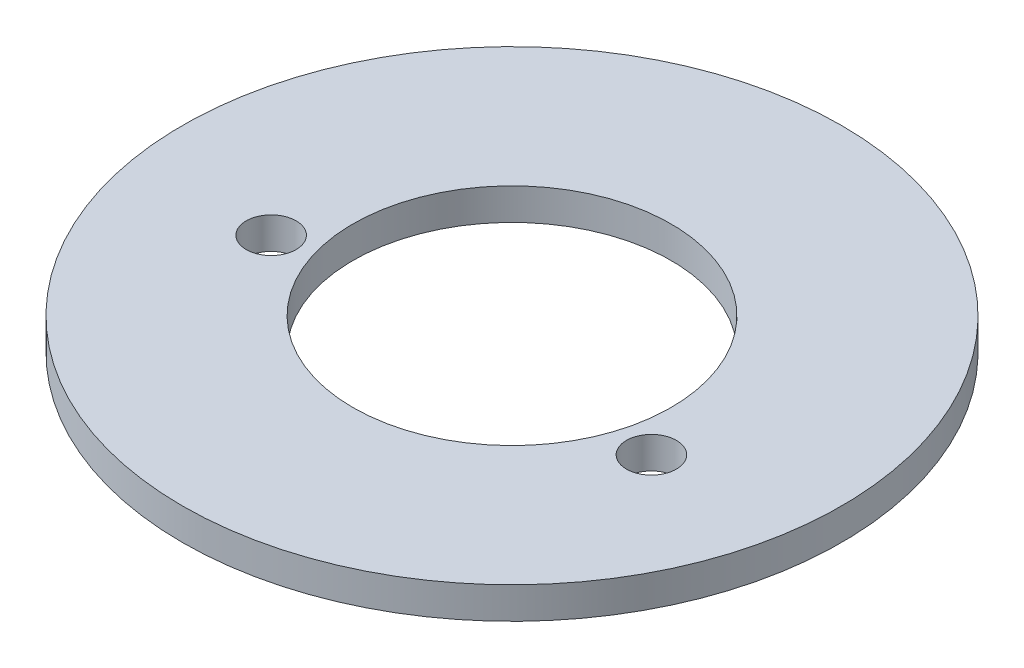
ISO-10303-21;
HEADER;
FILE_DESCRIPTION(('STEP AP214'),'2;1');
FILE_NAME('part.step','',(''),(''),'','','');
FILE_SCHEMA(('AUTOMOTIVE_DESIGN { 1 0 10303 214 1 1 1 1 }'));
ENDSEC;
DATA;
#1=APPLICATION_CONTEXT('core data for automotive mechanical design processes');
#2=APPLICATION_PROTOCOL_DEFINITION('international standard','automotive_design',2000,#1);
#3=PRODUCT_CONTEXT('',#1,'mechanical');
#4=PRODUCT('Part','Part','',(#3));
#5=PRODUCT_RELATED_PRODUCT_CATEGORY('part','',(#4));
#6=PRODUCT_DEFINITION_FORMATION('','',#4);
#7=PRODUCT_DEFINITION_CONTEXT('part definition',#1,'design');
#8=PRODUCT_DEFINITION('design','',#6,#7);
#9=PRODUCT_DEFINITION_SHAPE('','',#8);
#10=(LENGTH_UNIT() NAMED_UNIT(*) SI_UNIT(.MILLI.,.METRE.));
#11=(NAMED_UNIT(*) PLANE_ANGLE_UNIT() SI_UNIT($,.RADIAN.));
#12=(NAMED_UNIT(*) SI_UNIT($,.STERADIAN.) SOLID_ANGLE_UNIT());
#13=UNCERTAINTY_MEASURE_WITH_UNIT(LENGTH_MEASURE(1.E-05),#10,'distance_accuracy_value','');
#14=(GEOMETRIC_REPRESENTATION_CONTEXT(3) GLOBAL_UNCERTAINTY_ASSIGNED_CONTEXT((#13)) GLOBAL_UNIT_ASSIGNED_CONTEXT((#10,
#11,#12)) REPRESENTATION_CONTEXT('',''));
#15=CARTESIAN_POINT('',(0.,0.,0.));
#16=DIRECTION('',(0.,0.,1.));
#17=DIRECTION('',(1.,0.,0.));
#18=AXIS2_PLACEMENT_3D('',#15,#16,#17);
#19=CARTESIAN_POINT('',(0.,6.35,0.));
#20=DIRECTION('',(0.,-1.,0.));
#21=DIRECTION('',(0.,0.,-1.));
#22=AXIS2_PLACEMENT_3D('',#19,#20,#21);
#23=CYLINDRICAL_SURFACE('',#22,66.04);
#24=CARTESIAN_POINT('',(0.,6.35,0.));
#25=DIRECTION('',(0.,1.,0.));
#26=DIRECTION('',(0.,0.,1.));
#27=AXIS2_PLACEMENT_3D('',#24,#25,#26);
#28=CIRCLE('',#27,66.04);
#29=CARTESIAN_POINT('',(0.,6.35,66.04));
#30=VERTEX_POINT('',#29);
#31=EDGE_CURVE('E10',#30,#30,#28,.T.);
#32=ORIENTED_EDGE('',*,*,#31,.F.);
#33=EDGE_LOOP('',(#32));
#34=FACE_BOUND('',#33,.T.);
#35=CARTESIAN_POINT('',(0.,0.,0.));
#36=DIRECTION('',(0.,1.,0.));
#37=DIRECTION('',(0.,0.,1.));
#38=AXIS2_PLACEMENT_3D('',#35,#36,#37);
#39=CIRCLE('',#38,66.04);
#40=CARTESIAN_POINT('',(0.,0.,66.04));
#41=VERTEX_POINT('',#40);
#42=EDGE_CURVE('E34',#41,#41,#39,.T.);
#43=ORIENTED_EDGE('',*,*,#42,.T.);
#44=EDGE_LOOP('',(#43));
#45=FACE_BOUND('',#44,.T.);
#46=ADVANCED_FACE('F31',(#34,#45),#23,.T.);
#47=CARTESIAN_POINT('',(0.,6.35,0.));
#48=DIRECTION('',(0.,1.,0.));
#49=DIRECTION('',(0.,0.,1.));
#50=AXIS2_PLACEMENT_3D('',#47,#48,#49);
#51=PLANE('',#50);
#52=CARTESIAN_POINT('',(38.1,6.35,10.16));
#53=DIRECTION('',(0.,1.,0.));
#54=DIRECTION('',(0.,0.,1.));
#55=AXIS2_PLACEMENT_3D('',#52,#53,#54);
#56=CIRCLE('',#55,5.);
#57=CARTESIAN_POINT('',(38.1,6.35,15.16));
#58=VERTEX_POINT('',#57);
#59=EDGE_CURVE('E55',#58,#58,#56,.T.);
#60=ORIENTED_EDGE('',*,*,#59,.F.);
#61=EDGE_LOOP('',(#60));
#62=FACE_BOUND('',#61,.T.);
#63=CARTESIAN_POINT('',(-38.1,6.35,10.16));
#64=DIRECTION('',(0.,1.,0.));
#65=DIRECTION('',(0.,0.,1.));
#66=AXIS2_PLACEMENT_3D('',#63,#64,#65);
#67=CIRCLE('',#66,5.);
#68=CARTESIAN_POINT('',(-38.1,6.35,15.16));
#69=VERTEX_POINT('',#68);
#70=EDGE_CURVE('E49',#69,#69,#67,.T.);
#71=ORIENTED_EDGE('',*,*,#70,.F.);
#72=EDGE_LOOP('',(#71));
#73=FACE_BOUND('',#72,.T.);
#74=CARTESIAN_POINT('',(0.,6.35,0.));
#75=DIRECTION('',(0.,1.,0.));
#76=DIRECTION('',(0.,0.,1.));
#77=AXIS2_PLACEMENT_3D('',#74,#75,#76);
#78=CIRCLE('',#77,31.877);
#79=CARTESIAN_POINT('',(0.,6.35,31.877));
#80=VERTEX_POINT('',#79);
#81=EDGE_CURVE('E43',#80,#80,#78,.T.);
#82=ORIENTED_EDGE('',*,*,#81,.F.);
#83=EDGE_LOOP('',(#82));
#84=FACE_BOUND('',#83,.T.);
#85=ORIENTED_EDGE('',*,*,#31,.T.);
#86=EDGE_LOOP('',(#85));
#87=FACE_BOUND('',#86,.T.);
#88=ADVANCED_FACE('F71',(#62,#73,#84,#87),#51,.T.);
#89=CARTESIAN_POINT('',(0.,0.,0.));
#90=DIRECTION('',(0.,1.,0.));
#91=DIRECTION('',(0.,0.,1.));
#92=AXIS2_PLACEMENT_3D('',#89,#90,#91);
#93=PLANE('',#92);
#94=CARTESIAN_POINT('',(38.1,0.,10.16));
#95=DIRECTION('',(0.,1.,0.));
#96=DIRECTION('',(0.,0.,1.));
#97=AXIS2_PLACEMENT_3D('',#94,#95,#96);
#98=CIRCLE('',#97,5.);
#99=CARTESIAN_POINT('',(38.1,0.,15.16));
#100=VERTEX_POINT('',#99);
#101=EDGE_CURVE('E46',#100,#100,#98,.T.);
#102=ORIENTED_EDGE('',*,*,#101,.T.);
#103=EDGE_LOOP('',(#102));
#104=FACE_BOUND('',#103,.T.);
#105=CARTESIAN_POINT('',(-38.1,0.,10.16));
#106=DIRECTION('',(0.,1.,0.));
#107=DIRECTION('',(0.,0.,1.));
#108=AXIS2_PLACEMENT_3D('',#105,#106,#107);
#109=CIRCLE('',#108,5.);
#110=CARTESIAN_POINT('',(-38.1,0.,15.16));
#111=VERTEX_POINT('',#110);
#112=EDGE_CURVE('E52',#111,#111,#109,.T.);
#113=ORIENTED_EDGE('',*,*,#112,.T.);
#114=EDGE_LOOP('',(#113));
#115=FACE_BOUND('',#114,.T.);
#116=CARTESIAN_POINT('',(0.,0.,0.));
#117=DIRECTION('',(0.,1.,0.));
#118=DIRECTION('',(0.,0.,1.));
#119=AXIS2_PLACEMENT_3D('',#116,#117,#118);
#120=CIRCLE('',#119,31.877);
#121=CARTESIAN_POINT('',(0.,0.,31.877));
#122=VERTEX_POINT('',#121);
#123=EDGE_CURVE('E41',#122,#122,#120,.T.);
#124=ORIENTED_EDGE('',*,*,#123,.T.);
#125=EDGE_LOOP('',(#124));
#126=FACE_BOUND('',#125,.T.);
#127=ORIENTED_EDGE('',*,*,#42,.F.);
#128=EDGE_LOOP('',(#127));
#129=FACE_BOUND('',#128,.T.);
#130=ADVANCED_FACE('F61',(#104,#115,#126,#129),#93,.F.);
#131=CARTESIAN_POINT('',(0.,0.,0.));
#132=DIRECTION('',(0.,1.,0.));
#133=DIRECTION('',(0.,0.,1.));
#134=AXIS2_PLACEMENT_3D('',#131,#132,#133);
#135=CYLINDRICAL_SURFACE('',#134,31.877);
#136=ORIENTED_EDGE('',*,*,#123,.F.);
#137=EDGE_LOOP('',(#136));
#138=FACE_BOUND('',#137,.T.);
#139=ORIENTED_EDGE('',*,*,#81,.T.);
#140=EDGE_LOOP('',(#139));
#141=FACE_BOUND('',#140,.T.);
#142=ADVANCED_FACE('F79',(#138,#141),#135,.F.);
#143=CARTESIAN_POINT('',(-38.1,0.,10.16));
#144=DIRECTION('',(0.,1.,0.));
#145=DIRECTION('',(0.,0.,1.));
#146=AXIS2_PLACEMENT_3D('',#143,#144,#145);
#147=CYLINDRICAL_SURFACE('',#146,5.);
#148=ORIENTED_EDGE('',*,*,#112,.F.);
#149=EDGE_LOOP('',(#148));
#150=FACE_BOUND('',#149,.T.);
#151=ORIENTED_EDGE('',*,*,#70,.T.);
#152=EDGE_LOOP('',(#151));
#153=FACE_BOUND('',#152,.T.);
#154=ADVANCED_FACE('F67',(#150,#153),#147,.F.);
#155=CARTESIAN_POINT('',(38.1,0.,10.16));
#156=DIRECTION('',(0.,1.,0.));
#157=DIRECTION('',(0.,0.,1.));
#158=AXIS2_PLACEMENT_3D('',#155,#156,#157);
#159=CYLINDRICAL_SURFACE('',#158,5.);
#160=ORIENTED_EDGE('',*,*,#101,.F.);
#161=EDGE_LOOP('',(#160));
#162=FACE_BOUND('',#161,.T.);
#163=ORIENTED_EDGE('',*,*,#59,.T.);
#164=EDGE_LOOP('',(#163));
#165=FACE_BOUND('',#164,.T.);
#166=ADVANCED_FACE('F64',(#162,#165),#159,.F.);
#167=CLOSED_SHELL('',(#46,#88,#130,#142,#154,#166));
#168=MANIFOLD_SOLID_BREP('B2',#167);
#169=ADVANCED_BREP_SHAPE_REPRESENTATION('',(#18,#168),#14);
#170=SHAPE_DEFINITION_REPRESENTATION(#9,#169);
ENDSEC;
END-ISO-10303-21;
